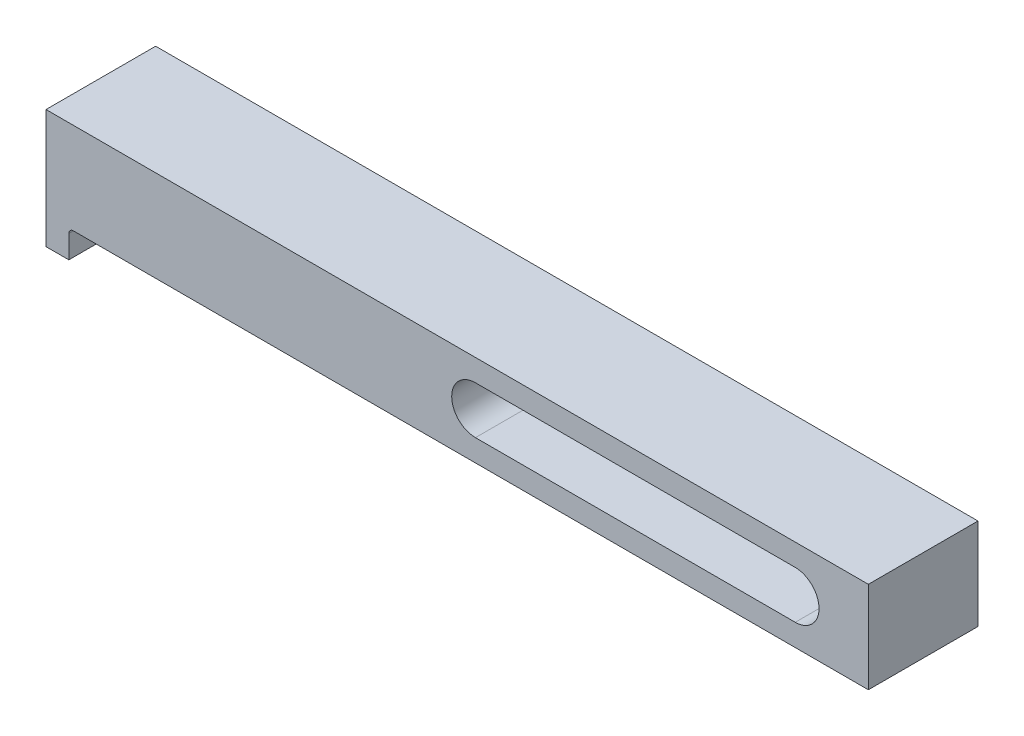
ISO-10303-21;
HEADER;
FILE_DESCRIPTION(('STEP AP214'),'2;1');
FILE_NAME('part.step','',(''),(''),'','','');
FILE_SCHEMA(('AUTOMOTIVE_DESIGN { 1 0 10303 214 1 1 1 1 }'));
ENDSEC;
DATA;
#1=APPLICATION_CONTEXT('core data for automotive mechanical design processes');
#2=APPLICATION_PROTOCOL_DEFINITION('international standard','automotive_design',2000,#1);
#3=PRODUCT_CONTEXT('',#1,'mechanical');
#4=PRODUCT('Part','Part','',(#3));
#5=PRODUCT_RELATED_PRODUCT_CATEGORY('part','',(#4));
#6=PRODUCT_DEFINITION_FORMATION('','',#4);
#7=PRODUCT_DEFINITION_CONTEXT('part definition',#1,'design');
#8=PRODUCT_DEFINITION('design','',#6,#7);
#9=PRODUCT_DEFINITION_SHAPE('','',#8);
#10=(LENGTH_UNIT() NAMED_UNIT(*) SI_UNIT(.MILLI.,.METRE.));
#11=(NAMED_UNIT(*) PLANE_ANGLE_UNIT() SI_UNIT($,.RADIAN.));
#12=(NAMED_UNIT(*) SI_UNIT($,.STERADIAN.) SOLID_ANGLE_UNIT());
#13=UNCERTAINTY_MEASURE_WITH_UNIT(LENGTH_MEASURE(1.E-05),#10,'distance_accuracy_value','');
#14=(GEOMETRIC_REPRESENTATION_CONTEXT(3) GLOBAL_UNCERTAINTY_ASSIGNED_CONTEXT((#13)) GLOBAL_UNIT_ASSIGNED_CONTEXT((#10,
#11,#12)) REPRESENTATION_CONTEXT('',''));
#15=CARTESIAN_POINT('',(0.,0.,0.));
#16=DIRECTION('',(0.,0.,1.));
#17=DIRECTION('',(1.,0.,0.));
#18=AXIS2_PLACEMENT_3D('',#15,#16,#17);
#19=CARTESIAN_POINT('',(0.,0.,12.));
#20=DIRECTION('',(0.,1.,0.));
#21=DIRECTION('',(0.,0.,1.));
#22=AXIS2_PLACEMENT_3D('',#19,#20,#21);
#23=PLANE('',#22);
#24=DIRECTION('',(1.,0.,0.));
#25=VECTOR('',#24,1.);
#26=CARTESIAN_POINT('',(0.,0.,12.));
#27=LINE('',#26,#25);
#28=CARTESIAN_POINT('',(3.,0.,12.));
#29=VERTEX_POINT('',#28);
#30=CARTESIAN_POINT('',(90.,0.,12.));
#31=VERTEX_POINT('',#30);
#32=EDGE_CURVE('E171',#29,#31,#27,.T.);
#33=ORIENTED_EDGE('',*,*,#32,.F.);
#34=DIRECTION('',(0.,0.,1.));
#35=VECTOR('',#34,1.);
#36=CARTESIAN_POINT('',(3.,0.,0.));
#37=LINE('',#36,#35);
#38=CARTESIAN_POINT('',(3.,0.,0.));
#39=VERTEX_POINT('',#38);
#40=EDGE_CURVE('E54',#29,#39,#37,.F.);
#41=ORIENTED_EDGE('',*,*,#40,.T.);
#42=DIRECTION('',(1.,0.,0.));
#43=VECTOR('',#42,1.);
#44=CARTESIAN_POINT('',(0.,0.,0.));
#45=LINE('',#44,#43);
#46=CARTESIAN_POINT('',(90.,0.,0.));
#47=VERTEX_POINT('',#46);
#48=EDGE_CURVE('E180',#39,#47,#45,.T.);
#49=ORIENTED_EDGE('',*,*,#48,.T.);
#50=DIRECTION('',(0.,0.,-1.));
#51=VECTOR('',#50,1.);
#52=CARTESIAN_POINT('',(90.,0.,12.));
#53=LINE('',#52,#51);
#54=EDGE_CURVE('E185',#31,#47,#53,.T.);
#55=ORIENTED_EDGE('',*,*,#54,.F.);
#56=EDGE_LOOP('',(#33,#41,#49,#55));
#57=FACE_BOUND('',#56,.T.);
#58=ADVANCED_FACE('F33',(#57),#23,.F.);
#59=CARTESIAN_POINT('',(0.,0.,12.));
#60=DIRECTION('',(1.,0.,0.));
#61=DIRECTION('',(0.,0.,-1.));
#62=AXIS2_PLACEMENT_3D('',#59,#60,#61);
#63=PLANE('',#62);
#64=DIRECTION('',(0.,-1.,0.));
#65=VECTOR('',#64,1.);
#66=CARTESIAN_POINT('',(0.,0.,0.));
#67=LINE('',#66,#65);
#68=CARTESIAN_POINT('',(0.,10.,0.));
#69=VERTEX_POINT('',#68);
#70=CARTESIAN_POINT('',(0.,-3.,0.));
#71=VERTEX_POINT('',#70);
#72=EDGE_CURVE('E198',#69,#71,#67,.T.);
#73=ORIENTED_EDGE('',*,*,#72,.T.);
#74=DIRECTION('',(0.,0.,-1.));
#75=VECTOR('',#74,1.);
#76=CARTESIAN_POINT('',(0.,-3.,12.));
#77=LINE('',#76,#75);
#78=CARTESIAN_POINT('',(0.,-3.,12.));
#79=VERTEX_POINT('',#78);
#80=EDGE_CURVE('E158',#79,#71,#77,.T.);
#81=ORIENTED_EDGE('',*,*,#80,.F.);
#82=DIRECTION('',(0.,-1.,0.));
#83=VECTOR('',#82,1.);
#84=CARTESIAN_POINT('',(0.,0.,12.));
#85=LINE('',#84,#83);
#86=CARTESIAN_POINT('',(0.,10.,12.));
#87=VERTEX_POINT('',#86);
#88=EDGE_CURVE('E169',#87,#79,#85,.T.);
#89=ORIENTED_EDGE('',*,*,#88,.F.);
#90=DIRECTION('',(0.,0.,-1.));
#91=VECTOR('',#90,1.);
#92=CARTESIAN_POINT('',(0.,10.,12.));
#93=LINE('',#92,#91);
#94=EDGE_CURVE('E204',#87,#69,#93,.T.);
#95=ORIENTED_EDGE('',*,*,#94,.T.);
#96=EDGE_LOOP('',(#73,#81,#89,#95));
#97=FACE_BOUND('',#96,.T.);
#98=ADVANCED_FACE('F228',(#97),#63,.F.);
#99=CARTESIAN_POINT('',(90.,0.,12.));
#100=DIRECTION('',(-1.,0.,0.));
#101=DIRECTION('',(0.,0.,1.));
#102=AXIS2_PLACEMENT_3D('',#99,#100,#101);
#103=PLANE('',#102);
#104=DIRECTION('',(0.,1.,0.));
#105=VECTOR('',#104,1.);
#106=CARTESIAN_POINT('',(90.,0.,0.));
#107=LINE('',#106,#105);
#108=CARTESIAN_POINT('',(90.,10.,0.));
#109=VERTEX_POINT('',#108);
#110=EDGE_CURVE('E209',#47,#109,#107,.T.);
#111=ORIENTED_EDGE('',*,*,#110,.T.);
#112=DIRECTION('',(0.,0.,-1.));
#113=VECTOR('',#112,1.);
#114=CARTESIAN_POINT('',(90.,10.,12.));
#115=LINE('',#114,#113);
#116=CARTESIAN_POINT('',(90.,10.,12.));
#117=VERTEX_POINT('',#116);
#118=EDGE_CURVE('E191',#117,#109,#115,.T.);
#119=ORIENTED_EDGE('',*,*,#118,.F.);
#120=DIRECTION('',(0.,1.,0.));
#121=VECTOR('',#120,1.);
#122=CARTESIAN_POINT('',(90.,0.,12.));
#123=LINE('',#122,#121);
#124=EDGE_CURVE('E175',#31,#117,#123,.T.);
#125=ORIENTED_EDGE('',*,*,#124,.F.);
#126=ORIENTED_EDGE('',*,*,#54,.T.);
#127=EDGE_LOOP('',(#111,#119,#125,#126));
#128=FACE_BOUND('',#127,.T.);
#129=ADVANCED_FACE('F219',(#128),#103,.F.);
#130=CARTESIAN_POINT('',(0.,10.,12.));
#131=DIRECTION('',(0.,-1.,0.));
#132=DIRECTION('',(0.,0.,-1.));
#133=AXIS2_PLACEMENT_3D('',#130,#131,#132);
#134=PLANE('',#133);
#135=DIRECTION('',(-1.,0.,0.));
#136=VECTOR('',#135,1.);
#137=CARTESIAN_POINT('',(0.,10.,0.));
#138=LINE('',#137,#136);
#139=EDGE_CURVE('E172',#109,#69,#138,.T.);
#140=ORIENTED_EDGE('',*,*,#139,.T.);
#141=ORIENTED_EDGE('',*,*,#94,.F.);
#142=DIRECTION('',(-1.,0.,0.));
#143=VECTOR('',#142,1.);
#144=CARTESIAN_POINT('',(0.,10.,12.));
#145=LINE('',#144,#143);
#146=EDGE_CURVE('E207',#117,#87,#145,.T.);
#147=ORIENTED_EDGE('',*,*,#146,.F.);
#148=ORIENTED_EDGE('',*,*,#118,.T.);
#149=EDGE_LOOP('',(#140,#141,#147,#148));
#150=FACE_BOUND('',#149,.T.);
#151=ADVANCED_FACE('F223',(#150),#134,.F.);
#152=CARTESIAN_POINT('',(0.,10.,12.));
#153=DIRECTION('',(0.,0.,-1.));
#154=DIRECTION('',(-1.,0.,0.));
#155=AXIS2_PLACEMENT_3D('',#152,#153,#154);
#156=PLANE('',#155);
#157=DIRECTION('',(1.,0.,0.));
#158=VECTOR('',#157,1.);
#159=CARTESIAN_POINT('',(0.,7.6,12.));
#160=LINE('',#159,#158);
#161=CARTESIAN_POINT('',(47.,7.6,12.));
#162=VERTEX_POINT('',#161);
#163=CARTESIAN_POINT('',(82.,7.6,12.));
#164=VERTEX_POINT('',#163);
#165=EDGE_CURVE('E152',#162,#164,#160,.T.);
#166=ORIENTED_EDGE('',*,*,#165,.T.);
#167=CARTESIAN_POINT('',(82.,5.,12.));
#168=DIRECTION('',(0.,0.,-1.));
#169=DIRECTION('',(-1.,0.,0.));
#170=AXIS2_PLACEMENT_3D('',#167,#168,#169);
#171=CIRCLE('',#170,2.6);
#172=CARTESIAN_POINT('',(82.,2.4,12.));
#173=VERTEX_POINT('',#172);
#174=EDGE_CURVE('E155',#164,#173,#171,.T.);
#175=ORIENTED_EDGE('',*,*,#174,.T.);
#176=DIRECTION('',(-1.,0.,0.));
#177=VECTOR('',#176,1.);
#178=CARTESIAN_POINT('',(0.,2.4,12.));
#179=LINE('',#178,#177);
#180=CARTESIAN_POINT('',(47.,2.4,12.));
#181=VERTEX_POINT('',#180);
#182=EDGE_CURVE('E147',#173,#181,#179,.T.);
#183=ORIENTED_EDGE('',*,*,#182,.T.);
#184=CARTESIAN_POINT('',(47.,5.,12.));
#185=DIRECTION('',(0.,0.,-1.));
#186=DIRECTION('',(-1.,0.,0.));
#187=AXIS2_PLACEMENT_3D('',#184,#185,#186);
#188=CIRCLE('',#187,2.6);
#189=EDGE_CURVE('E122',#181,#162,#188,.T.);
#190=ORIENTED_EDGE('',*,*,#189,.T.);
#191=EDGE_LOOP('',(#166,#175,#183,#190));
#192=FACE_BOUND('',#191,.T.);
#193=ORIENTED_EDGE('',*,*,#88,.T.);
#194=DIRECTION('',(-1.,0.,0.));
#195=VECTOR('',#194,1.);
#196=CARTESIAN_POINT('',(0.,-3.,12.));
#197=LINE('',#196,#195);
#198=CARTESIAN_POINT('',(2.5,-3.,12.));
#199=VERTEX_POINT('',#198);
#200=EDGE_CURVE('E165',#199,#79,#197,.T.);
#201=ORIENTED_EDGE('',*,*,#200,.F.);
#202=DIRECTION('',(0.,1.,0.));
#203=VECTOR('',#202,1.);
#204=CARTESIAN_POINT('',(2.5,-3.,12.));
#205=LINE('',#204,#203);
#206=CARTESIAN_POINT('',(2.5,-0.5,12.));
#207=VERTEX_POINT('',#206);
#208=EDGE_CURVE('E168',#199,#207,#205,.T.);
#209=ORIENTED_EDGE('',*,*,#208,.T.);
#210=CARTESIAN_POINT('',(3.,-0.5,12.));
#211=DIRECTION('',(0.,0.,-1.));
#212=DIRECTION('',(-1.,0.,0.));
#213=AXIS2_PLACEMENT_3D('',#210,#211,#212);
#214=CIRCLE('',#213,0.5);
#215=EDGE_CURVE('E41',#207,#29,#214,.T.);
#216=ORIENTED_EDGE('',*,*,#215,.T.);
#217=ORIENTED_EDGE('',*,*,#32,.T.);
#218=ORIENTED_EDGE('',*,*,#124,.T.);
#219=ORIENTED_EDGE('',*,*,#146,.T.);
#220=EDGE_LOOP('',(#193,#201,#209,#216,#217,#218,#219));
#221=FACE_BOUND('',#220,.T.);
#222=ADVANCED_FACE('F216',(#192,#221),#156,.F.);
#223=CARTESIAN_POINT('',(0.,10.,0.));
#224=DIRECTION('',(0.,0.,-1.));
#225=DIRECTION('',(-1.,0.,0.));
#226=AXIS2_PLACEMENT_3D('',#223,#224,#225);
#227=PLANE('',#226);
#228=CARTESIAN_POINT('',(82.,5.,0.));
#229=DIRECTION('',(0.,0.,-1.));
#230=DIRECTION('',(-1.,0.,0.));
#231=AXIS2_PLACEMENT_3D('',#228,#229,#230);
#232=CIRCLE('',#231,2.6);
#233=CARTESIAN_POINT('',(82.,7.6,0.));
#234=VERTEX_POINT('',#233);
#235=CARTESIAN_POINT('',(82.,2.4,0.));
#236=VERTEX_POINT('',#235);
#237=EDGE_CURVE('E135',#234,#236,#232,.T.);
#238=ORIENTED_EDGE('',*,*,#237,.F.);
#239=DIRECTION('',(1.,0.,0.));
#240=VECTOR('',#239,1.);
#241=CARTESIAN_POINT('',(82.,7.6,0.));
#242=LINE('',#241,#240);
#243=CARTESIAN_POINT('',(47.,7.6,0.));
#244=VERTEX_POINT('',#243);
#245=EDGE_CURVE('E140',#244,#234,#242,.T.);
#246=ORIENTED_EDGE('',*,*,#245,.F.);
#247=CARTESIAN_POINT('',(47.,5.,0.));
#248=DIRECTION('',(0.,0.,-1.));
#249=DIRECTION('',(-1.,0.,0.));
#250=AXIS2_PLACEMENT_3D('',#247,#248,#249);
#251=CIRCLE('',#250,2.6);
#252=CARTESIAN_POINT('',(47.,2.4,0.));
#253=VERTEX_POINT('',#252);
#254=EDGE_CURVE('E119',#253,#244,#251,.T.);
#255=ORIENTED_EDGE('',*,*,#254,.F.);
#256=DIRECTION('',(-1.,0.,0.));
#257=VECTOR('',#256,1.);
#258=CARTESIAN_POINT('',(82.,2.4,0.));
#259=LINE('',#258,#257);
#260=EDGE_CURVE('E130',#236,#253,#259,.T.);
#261=ORIENTED_EDGE('',*,*,#260,.F.);
#262=EDGE_LOOP('',(#238,#246,#255,#261));
#263=FACE_BOUND('',#262,.T.);
#264=ORIENTED_EDGE('',*,*,#72,.F.);
#265=ORIENTED_EDGE('',*,*,#139,.F.);
#266=ORIENTED_EDGE('',*,*,#110,.F.);
#267=ORIENTED_EDGE('',*,*,#48,.F.);
#268=CARTESIAN_POINT('',(3.,-0.5,0.));
#269=DIRECTION('',(0.,0.,-1.));
#270=DIRECTION('',(-1.,0.,0.));
#271=AXIS2_PLACEMENT_3D('',#268,#269,#270);
#272=CIRCLE('',#271,0.5);
#273=CARTESIAN_POINT('',(2.5,-0.5,0.));
#274=VERTEX_POINT('',#273);
#275=EDGE_CURVE('E11',#39,#274,#272,.F.);
#276=ORIENTED_EDGE('',*,*,#275,.T.);
#277=DIRECTION('',(0.,1.,0.));
#278=VECTOR('',#277,1.);
#279=CARTESIAN_POINT('',(2.5,-3.,0.));
#280=LINE('',#279,#278);
#281=CARTESIAN_POINT('',(2.5,-3.,0.));
#282=VERTEX_POINT('',#281);
#283=EDGE_CURVE('E196',#282,#274,#280,.T.);
#284=ORIENTED_EDGE('',*,*,#283,.F.);
#285=DIRECTION('',(1.,0.,0.));
#286=VECTOR('',#285,1.);
#287=CARTESIAN_POINT('',(0.,-3.,0.));
#288=LINE('',#287,#286);
#289=EDGE_CURVE('E161',#71,#282,#288,.T.);
#290=ORIENTED_EDGE('',*,*,#289,.F.);
#291=EDGE_LOOP('',(#264,#265,#266,#267,#276,#284,#290));
#292=FACE_BOUND('',#291,.T.);
#293=ADVANCED_FACE('F137',(#263,#292),#227,.T.);
#294=CARTESIAN_POINT('',(2.5,-3.,12.));
#295=DIRECTION('',(-1.,0.,0.));
#296=DIRECTION('',(0.,0.,1.));
#297=AXIS2_PLACEMENT_3D('',#294,#295,#296);
#298=PLANE('',#297);
#299=ORIENTED_EDGE('',*,*,#283,.T.);
#300=DIRECTION('',(0.,0.,1.));
#301=VECTOR('',#300,1.);
#302=CARTESIAN_POINT('',(2.5,-0.5,12.));
#303=LINE('',#302,#301);
#304=EDGE_CURVE('E183',#274,#207,#303,.T.);
#305=ORIENTED_EDGE('',*,*,#304,.T.);
#306=ORIENTED_EDGE('',*,*,#208,.F.);
#307=DIRECTION('',(0.,0.,1.));
#308=VECTOR('',#307,1.);
#309=CARTESIAN_POINT('',(2.5,-3.,12.));
#310=LINE('',#309,#308);
#311=EDGE_CURVE('E163',#282,#199,#310,.T.);
#312=ORIENTED_EDGE('',*,*,#311,.F.);
#313=EDGE_LOOP('',(#299,#305,#306,#312));
#314=FACE_BOUND('',#313,.T.);
#315=ADVANCED_FACE('F235',(#314),#298,.F.);
#316=CARTESIAN_POINT('',(0.,-3.,0.));
#317=DIRECTION('',(0.,-1.,0.));
#318=DIRECTION('',(0.,0.,-1.));
#319=AXIS2_PLACEMENT_3D('',#316,#317,#318);
#320=PLANE('',#319);
#321=ORIENTED_EDGE('',*,*,#80,.T.);
#322=ORIENTED_EDGE('',*,*,#289,.T.);
#323=ORIENTED_EDGE('',*,*,#311,.T.);
#324=ORIENTED_EDGE('',*,*,#200,.T.);
#325=EDGE_LOOP('',(#321,#322,#323,#324));
#326=FACE_BOUND('',#325,.T.);
#327=ADVANCED_FACE('F231',(#326),#320,.T.);
#328=CARTESIAN_POINT('',(82.,5.,12.00005));
#329=DIRECTION('',(0.,0.,-1.));
#330=DIRECTION('',(-1.,0.,0.));
#331=AXIS2_PLACEMENT_3D('',#328,#329,#330);
#332=CYLINDRICAL_SURFACE('',#331,2.6);
#333=DIRECTION('',(0.,0.,-1.));
#334=VECTOR('',#333,1.);
#335=CARTESIAN_POINT('',(82.,7.6,12.00005));
#336=LINE('',#335,#334);
#337=EDGE_CURVE('E145',#164,#234,#336,.T.);
#338=ORIENTED_EDGE('',*,*,#337,.T.);
#339=ORIENTED_EDGE('',*,*,#237,.T.);
#340=DIRECTION('',(0.,0.,-1.));
#341=VECTOR('',#340,1.);
#342=CARTESIAN_POINT('',(82.,2.4,12.00005));
#343=LINE('',#342,#341);
#344=EDGE_CURVE('E126',#173,#236,#343,.T.);
#345=ORIENTED_EDGE('',*,*,#344,.F.);
#346=ORIENTED_EDGE('',*,*,#174,.F.);
#347=EDGE_LOOP('',(#338,#339,#345,#346));
#348=FACE_BOUND('',#347,.T.);
#349=ADVANCED_FACE('F242',(#348),#332,.F.);
#350=CARTESIAN_POINT('',(82.,7.6,12.00005));
#351=DIRECTION('',(0.,1.,0.));
#352=DIRECTION('',(0.,0.,1.));
#353=AXIS2_PLACEMENT_3D('',#350,#351,#352);
#354=PLANE('',#353);
#355=DIRECTION('',(0.,0.,-1.));
#356=VECTOR('',#355,1.);
#357=CARTESIAN_POINT('',(47.,7.6,12.00005));
#358=LINE('',#357,#356);
#359=EDGE_CURVE('E125',#162,#244,#358,.T.);
#360=ORIENTED_EDGE('',*,*,#359,.T.);
#361=ORIENTED_EDGE('',*,*,#245,.T.);
#362=ORIENTED_EDGE('',*,*,#337,.F.);
#363=ORIENTED_EDGE('',*,*,#165,.F.);
#364=EDGE_LOOP('',(#360,#361,#362,#363));
#365=FACE_BOUND('',#364,.T.);
#366=ADVANCED_FACE('F261',(#365),#354,.F.);
#367=CARTESIAN_POINT('',(47.,5.,12.00005));
#368=DIRECTION('',(0.,0.,-1.));
#369=DIRECTION('',(-1.,0.,0.));
#370=AXIS2_PLACEMENT_3D('',#367,#368,#369);
#371=CYLINDRICAL_SURFACE('',#370,2.6);
#372=DIRECTION('',(0.,0.,-1.));
#373=VECTOR('',#372,1.);
#374=CARTESIAN_POINT('',(47.,2.4,12.00005));
#375=LINE('',#374,#373);
#376=EDGE_CURVE('E114',#181,#253,#375,.T.);
#377=ORIENTED_EDGE('',*,*,#376,.T.);
#378=ORIENTED_EDGE('',*,*,#254,.T.);
#379=ORIENTED_EDGE('',*,*,#359,.F.);
#380=ORIENTED_EDGE('',*,*,#189,.F.);
#381=EDGE_LOOP('',(#377,#378,#379,#380));
#382=FACE_BOUND('',#381,.T.);
#383=ADVANCED_FACE('F116',(#382),#371,.F.);
#384=CARTESIAN_POINT('',(82.,2.4,12.00005));
#385=DIRECTION('',(0.,-1.,0.));
#386=DIRECTION('',(0.,0.,-1.));
#387=AXIS2_PLACEMENT_3D('',#384,#385,#386);
#388=PLANE('',#387);
#389=ORIENTED_EDGE('',*,*,#344,.T.);
#390=ORIENTED_EDGE('',*,*,#260,.T.);
#391=ORIENTED_EDGE('',*,*,#376,.F.);
#392=ORIENTED_EDGE('',*,*,#182,.F.);
#393=EDGE_LOOP('',(#389,#390,#391,#392));
#394=FACE_BOUND('',#393,.T.);
#395=ADVANCED_FACE('F131',(#394),#388,.F.);
#396=CARTESIAN_POINT('',(3.,-0.5,12.));
#397=DIRECTION('',(0.,0.,-1.));
#398=DIRECTION('',(-1.,0.,0.));
#399=AXIS2_PLACEMENT_3D('',#396,#397,#398);
#400=CYLINDRICAL_SURFACE('',#399,0.5);
#401=ORIENTED_EDGE('',*,*,#275,.F.);
#402=ORIENTED_EDGE('',*,*,#40,.F.);
#403=ORIENTED_EDGE('',*,*,#215,.F.);
#404=ORIENTED_EDGE('',*,*,#304,.F.);
#405=EDGE_LOOP('',(#401,#402,#403,#404));
#406=FACE_BOUND('',#405,.T.);
#407=ADVANCED_FACE('F35',(#406),#400,.F.);
#408=CLOSED_SHELL('',(#58,#98,#129,#151,#222,#293,#315,#327,#349,#366,#383,#395,#407));
#409=MANIFOLD_SOLID_BREP('B2',#408);
#410=ADVANCED_BREP_SHAPE_REPRESENTATION('',(#18,#409),#14);
#411=SHAPE_DEFINITION_REPRESENTATION(#9,#410);
ENDSEC;
END-ISO-10303-21;
